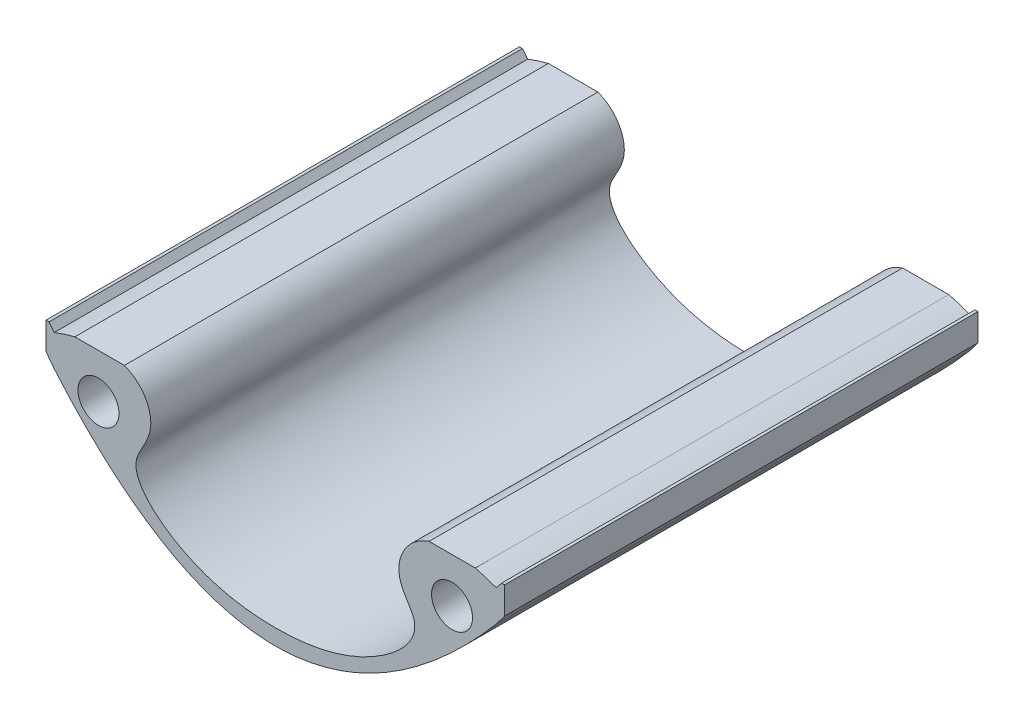
ISO-10303-21;
HEADER;
FILE_DESCRIPTION(('STEP AP214'),'2;1');
FILE_NAME('part.step','',(''),(''),'','','');
FILE_SCHEMA(('AUTOMOTIVE_DESIGN { 1 0 10303 214 1 1 1 1 }'));
ENDSEC;
DATA;
#1=APPLICATION_CONTEXT('core data for automotive mechanical design processes');
#2=APPLICATION_PROTOCOL_DEFINITION('international standard','automotive_design',2000,#1);
#3=PRODUCT_CONTEXT('',#1,'mechanical');
#4=PRODUCT('Part','Part','',(#3));
#5=PRODUCT_RELATED_PRODUCT_CATEGORY('part','',(#4));
#6=PRODUCT_DEFINITION_FORMATION('','',#4);
#7=PRODUCT_DEFINITION_CONTEXT('part definition',#1,'design');
#8=PRODUCT_DEFINITION('design','',#6,#7);
#9=PRODUCT_DEFINITION_SHAPE('','',#8);
#10=(LENGTH_UNIT() NAMED_UNIT(*) SI_UNIT(.MILLI.,.METRE.));
#11=(NAMED_UNIT(*) PLANE_ANGLE_UNIT() SI_UNIT($,.RADIAN.));
#12=(NAMED_UNIT(*) SI_UNIT($,.STERADIAN.) SOLID_ANGLE_UNIT());
#13=UNCERTAINTY_MEASURE_WITH_UNIT(LENGTH_MEASURE(1.E-05),#10,'distance_accuracy_value','');
#14=(GEOMETRIC_REPRESENTATION_CONTEXT(3) GLOBAL_UNCERTAINTY_ASSIGNED_CONTEXT((#13)) GLOBAL_UNIT_ASSIGNED_CONTEXT((#10,
#11,#12)) REPRESENTATION_CONTEXT('',''));
#15=CARTESIAN_POINT('',(0.,0.,0.));
#16=DIRECTION('',(0.,0.,1.));
#17=DIRECTION('',(1.,0.,0.));
#18=AXIS2_PLACEMENT_3D('',#15,#16,#17);
#19=CARTESIAN_POINT('',(35.,5.99999999999999,75.));
#20=CARTESIAN_POINT('',(24.2921708013809,10.0709870772063,75.));
#21=CARTESIAN_POINT('',(16.5043822104664,0.543390954215758,75.));
#22=CARTESIAN_POINT('',(25.4356568395255,-5.8640250434878,75.));
#23=CARTESIAN_POINT('',(14.4016739740054,-15.3382561778193,75.));
#24=CARTESIAN_POINT('',(0.0184245463514519,-17.8303801091997,75.));
#25=CARTESIAN_POINT('',(-14.4761462038401,-15.3053377993211,75.));
#26=CARTESIAN_POINT('',(-25.2121925396569,-5.97773988999585,75.));
#27=CARTESIAN_POINT('',(-16.8625489771599,0.916693829895384,75.));
#28=CARTESIAN_POINT('',(-23.9127171343916,10.2114500867204,75.));
#29=CARTESIAN_POINT('',(-35.,6.00000000000001,75.));
#30=B_SPLINE_CURVE_WITH_KNOTS('',3,(#19,#20,#21,#22,#23,#24,#25,#26,#27,#28,#29),.UNSPECIFIED.,
.F.,.F.,(4,1,1,1,1,1,1,1,4),(0.,0.0991916122989778,0.1945134469653,0.347327721109857,
0.496998051219649,0.646668381329442,0.799482655473999,0.89480449014032,1.),.UNSPECIFIED.);
#31=DIRECTION('',(0.,0.,-1.));
#32=VECTOR('',#31,1.);
#33=SURFACE_OF_LINEAR_EXTRUSION('',#30,#32);
#34=CARTESIAN_POINT('',(35.,5.99999999999999,0.));
#35=CARTESIAN_POINT('',(24.2921708013809,10.0709870772063,0.));
#36=CARTESIAN_POINT('',(16.5043822104664,0.543390954215758,0.));
#37=CARTESIAN_POINT('',(25.4356568395255,-5.8640250434878,0.));
#38=CARTESIAN_POINT('',(14.4016739740054,-15.3382561778193,0.));
#39=CARTESIAN_POINT('',(0.0184245463514519,-17.8303801091997,0.));
#40=CARTESIAN_POINT('',(-14.4761462038401,-15.3053377993211,0.));
#41=CARTESIAN_POINT('',(-25.2121925396569,-5.97773988999585,0.));
#42=CARTESIAN_POINT('',(-16.8625489771599,0.916693829895384,0.));
#43=CARTESIAN_POINT('',(-23.9127171343916,10.2114500867204,0.));
#44=CARTESIAN_POINT('',(-35.,6.00000000000001,0.));
#45=B_SPLINE_CURVE_WITH_KNOTS('',3,(#34,#35,#36,#37,#38,#39,#40,#41,#42,#43,#44),.UNSPECIFIED.,
.F.,.F.,(4,1,1,1,1,1,1,1,4),(0.,0.0991916122989778,0.1945134469653,0.347327721109857,
0.496998051219649,0.646668381329442,0.799482655473999,0.89480449014032,1.),.UNSPECIFIED.);
#46=CARTESIAN_POINT('',(35.,6.00000000000001,0.));
#47=VERTEX_POINT('',#46);
#48=CARTESIAN_POINT('',(31.6802542880278,7.03951031849051,0.));
#49=VERTEX_POINT('',#48);
#50=EDGE_CURVE('E387',#47,#49,#45,.T.);
#51=ORIENTED_EDGE('',*,*,#50,.T.);
#52=DIRECTION('',(0.,0.,-1.));
#53=VECTOR('',#52,1.);
#54=CARTESIAN_POINT('',(31.6802544507426,7.03951031849051,75.));
#55=LINE('',#54,#53);
#56=CARTESIAN_POINT('',(31.6802542880278,7.03951031849051,75.));
#57=VERTEX_POINT('',#56);
#58=EDGE_CURVE('E178',#49,#57,#55,.F.);
#59=ORIENTED_EDGE('',*,*,#58,.T.);
#60=CARTESIAN_POINT('',(35.,6.00000000000001,75.));
#61=VERTEX_POINT('',#60);
#62=EDGE_CURVE('E275',#61,#57,#30,.T.);
#63=ORIENTED_EDGE('',*,*,#62,.F.);
#64=DIRECTION('',(0.,0.,-1.));
#65=VECTOR('',#64,1.);
#66=CARTESIAN_POINT('',(35.,6.00000000000001,75.));
#67=LINE('',#66,#65);
#68=EDGE_CURVE('E385',#61,#47,#67,.T.);
#69=ORIENTED_EDGE('',*,*,#68,.T.);
#70=EDGE_LOOP('',(#51,#59,#63,#69));
#71=FACE_BOUND('',#70,.T.);
#72=ADVANCED_FACE('F39',(#71),#33,.F.);
#73=CARTESIAN_POINT('',(24.3666960420927,7.03951031849051,75.));
#74=VERTEX_POINT('',#73);
#75=CARTESIAN_POINT('',(-23.9011082918852,7.03951031849051,75.));
#76=VERTEX_POINT('',#75);
#77=EDGE_CURVE('E286',#74,#76,#30,.T.);
#78=ORIENTED_EDGE('',*,*,#77,.F.);
#79=DIRECTION('',(0.,0.,-1.));
#80=VECTOR('',#79,1.);
#81=CARTESIAN_POINT('',(24.3666960420927,7.03951031849051,75.));
#82=LINE('',#81,#80);
#83=CARTESIAN_POINT('',(24.3666960420927,7.03951031849051,0.));
#84=VERTEX_POINT('',#83);
#85=EDGE_CURVE('E197',#74,#84,#82,.T.);
#86=ORIENTED_EDGE('',*,*,#85,.T.);
#87=CARTESIAN_POINT('',(-23.9011082918852,7.03951031849051,0.));
#88=VERTEX_POINT('',#87);
#89=EDGE_CURVE('E348',#84,#88,#45,.T.);
#90=ORIENTED_EDGE('',*,*,#89,.T.);
#91=DIRECTION('',(0.,0.,-1.));
#92=VECTOR('',#91,1.);
#93=CARTESIAN_POINT('',(-23.9011081901879,7.03951031849051,75.));
#94=LINE('',#93,#92);
#95=EDGE_CURVE('E191',#88,#76,#94,.F.);
#96=ORIENTED_EDGE('',*,*,#95,.T.);
#97=EDGE_LOOP('',(#78,#86,#90,#96));
#98=FACE_BOUND('',#97,.T.);
#99=ADVANCED_FACE('F313',(#98),#33,.F.);
#100=CARTESIAN_POINT('',(-51.25,40.25,75.));
#101=DIRECTION('',(0.,0.,1.));
#102=DIRECTION('',(1.,0.,0.));
#103=AXIS2_PLACEMENT_3D('',#100,#101,#102);
#104=PLANE('',#103);
#105=DIRECTION('',(0.,-1.,0.));
#106=VECTOR('',#105,1.);
#107=CARTESIAN_POINT('',(36.3120835122941,40.25,75.));
#108=LINE('',#107,#106);
#109=CARTESIAN_POINT('',(36.3120835122942,7.03951031849051,75.));
#110=VERTEX_POINT('',#109);
#111=CARTESIAN_POINT('',(36.3120835122942,2.74184273874525,75.));
#112=VERTEX_POINT('',#111);
#113=EDGE_CURVE('E140',#110,#112,#108,.T.);
#114=ORIENTED_EDGE('',*,*,#113,.F.);
#115=DIRECTION('',(1.,0.,0.));
#116=VECTOR('',#115,1.);
#117=CARTESIAN_POINT('',(-51.25,7.03951031849051,75.));
#118=LINE('',#117,#116);
#119=CARTESIAN_POINT('',(35.842563463064,7.0395103184905,75.));
#120=VERTEX_POINT('',#119);
#121=EDGE_CURVE('E152',#120,#110,#118,.T.);
#122=ORIENTED_EDGE('',*,*,#121,.F.);
#123=CARTESIAN_POINT('',(38.,80.,75.));
#124=CARTESIAN_POINT('',(63.,40.,75.));
#125=CARTESIAN_POINT('',(35.,6.00000000000001,75.));
#126=B_SPLINE_CURVE_WITH_KNOTS('',2,(#123,#124,#125),.UNSPECIFIED.,.F.,.F.,(3,3),(0.,1.),.UNSPECIFIED.);
#127=EDGE_CURVE('E269',#120,#61,#126,.T.);
#128=ORIENTED_EDGE('',*,*,#127,.T.);
#129=ORIENTED_EDGE('',*,*,#62,.T.);
#130=EDGE_CURVE('E166',#74,#57,#118,.T.);
#131=ORIENTED_EDGE('',*,*,#130,.F.);
#132=ORIENTED_EDGE('',*,*,#77,.T.);
#133=CARTESIAN_POINT('',(-31.7421616075453,7.03951031849051,75.));
#134=VERTEX_POINT('',#133);
#135=EDGE_CURVE('E179',#134,#76,#118,.T.);
#136=ORIENTED_EDGE('',*,*,#135,.F.);
#137=CARTESIAN_POINT('',(-35.,6.00000000000001,75.));
#138=VERTEX_POINT('',#137);
#139=EDGE_CURVE('E274',#134,#138,#30,.T.);
#140=ORIENTED_EDGE('',*,*,#139,.T.);
#141=CARTESIAN_POINT('',(-35.,6.00000000000001,75.));
#142=CARTESIAN_POINT('',(-63.,40.,75.));
#143=CARTESIAN_POINT('',(-38.,80.,75.));
#144=B_SPLINE_CURVE_WITH_KNOTS('',2,(#141,#142,#143),.UNSPECIFIED.,.F.,.F.,(3,3),(0.,1.),.UNSPECIFIED.);
#145=CARTESIAN_POINT('',(-35.8425634630639,7.03951031849035,75.));
#146=VERTEX_POINT('',#145);
#147=EDGE_CURVE('E285',#138,#146,#144,.T.);
#148=ORIENTED_EDGE('',*,*,#147,.T.);
#149=CARTESIAN_POINT('',(-36.3120835122941,7.03951031849051,75.));
#150=VERTEX_POINT('',#149);
#151=EDGE_CURVE('E167',#150,#146,#118,.T.);
#152=ORIENTED_EDGE('',*,*,#151,.F.);
#153=DIRECTION('',(0.,1.,0.));
#154=VECTOR('',#153,1.);
#155=CARTESIAN_POINT('',(-36.3120835122941,40.25,75.));
#156=LINE('',#155,#154);
#157=CARTESIAN_POINT('',(-36.3120835122941,2.74184273874521,75.));
#158=VERTEX_POINT('',#157);
#159=EDGE_CURVE('E56',#158,#150,#156,.T.);
#160=ORIENTED_EDGE('',*,*,#159,.F.);
#161=CARTESIAN_POINT('',(-40.,80.,75.));
#162=CARTESIAN_POINT('',(-65.,40.,75.));
#163=CARTESIAN_POINT('',(-35.,0.999999999999992,75.));
#164=B_SPLINE_CURVE_WITH_KNOTS('',2,(#161,#162,#163),.UNSPECIFIED.,.F.,.F.,(3,3),(0.,1.),.UNSPECIFIED.);
#165=CARTESIAN_POINT('',(-35.,0.999999999999992,75.));
#166=VERTEX_POINT('',#165);
#167=EDGE_CURVE('E231',#158,#166,#164,.T.);
#168=ORIENTED_EDGE('',*,*,#167,.T.);
#169=CARTESIAN_POINT('',(-35.,0.999999999999992,75.));
#170=CARTESIAN_POINT('',(0.,-40.,75.));
#171=CARTESIAN_POINT('',(35.,1.00000000000001,75.));
#172=B_SPLINE_CURVE_WITH_KNOTS('',2,(#169,#170,#171),.UNSPECIFIED.,.F.,.F.,(3,3),(0.,1.),.UNSPECIFIED.);
#173=CARTESIAN_POINT('',(35.,1.00000000000001,75.));
#174=VERTEX_POINT('',#173);
#175=EDGE_CURVE('E237',#166,#174,#172,.T.);
#176=ORIENTED_EDGE('',*,*,#175,.T.);
#177=CARTESIAN_POINT('',(35.,1.00000000000001,75.));
#178=CARTESIAN_POINT('',(65.,40.,75.));
#179=CARTESIAN_POINT('',(40.,80.,75.));
#180=B_SPLINE_CURVE_WITH_KNOTS('',2,(#177,#178,#179),.UNSPECIFIED.,.F.,.F.,(3,3),(0.,1.),.UNSPECIFIED.);
#181=EDGE_CURVE('E155',#174,#112,#180,.T.);
#182=ORIENTED_EDGE('',*,*,#181,.T.);
#183=EDGE_LOOP('',(#114,#122,#128,#129,#131,#132,#136,#140,#148,#152,#160,#168,#176,#182));
#184=FACE_BOUND('',#183,.T.);
#185=CARTESIAN_POINT('',(-28.,0.,75.));
#186=DIRECTION('',(0.,0.,1.));
#187=DIRECTION('',(1.,0.,0.));
#188=AXIS2_PLACEMENT_3D('',#185,#186,#187);
#189=CIRCLE('',#188,3.25);
#190=CARTESIAN_POINT('',(-24.75,0.,75.));
#191=VERTEX_POINT('',#190);
#192=EDGE_CURVE('E224',#191,#191,#189,.T.);
#193=ORIENTED_EDGE('',*,*,#192,.F.);
#194=EDGE_LOOP('',(#193));
#195=FACE_BOUND('',#194,.T.);
#196=CARTESIAN_POINT('',(28.,0.,75.));
#197=DIRECTION('',(0.,0.,1.));
#198=DIRECTION('',(1.,0.,0.));
#199=AXIS2_PLACEMENT_3D('',#196,#197,#198);
#200=CIRCLE('',#199,3.25);
#201=CARTESIAN_POINT('',(31.25,0.,75.));
#202=VERTEX_POINT('',#201);
#203=EDGE_CURVE('E171',#202,#202,#200,.T.);
#204=ORIENTED_EDGE('',*,*,#203,.F.);
#205=EDGE_LOOP('',(#204));
#206=FACE_BOUND('',#205,.T.);
#207=ADVANCED_FACE('F150',(#184,#195,#206),#104,.T.);
#208=CARTESIAN_POINT('',(-51.25,40.25,0.));
#209=DIRECTION('',(0.,0.,1.));
#210=DIRECTION('',(1.,0.,0.));
#211=AXIS2_PLACEMENT_3D('',#208,#209,#210);
#212=PLANE('',#211);
#213=DIRECTION('',(1.,0.,0.));
#214=VECTOR('',#213,1.);
#215=CARTESIAN_POINT('',(-51.25,7.03951031849051,0.));
#216=LINE('',#215,#214);
#217=CARTESIAN_POINT('',(35.8425634630639,7.03951031849033,0.));
#218=VERTEX_POINT('',#217);
#219=CARTESIAN_POINT('',(36.3120835122941,7.03951031849051,0.));
#220=VERTEX_POINT('',#219);
#221=EDGE_CURVE('E164',#218,#220,#216,.T.);
#222=ORIENTED_EDGE('',*,*,#221,.T.);
#223=DIRECTION('',(0.,-1.,0.));
#224=VECTOR('',#223,1.);
#225=CARTESIAN_POINT('',(36.3120835122941,40.25,0.));
#226=LINE('',#225,#224);
#227=CARTESIAN_POINT('',(36.3120835122942,2.74184273874525,0.));
#228=VERTEX_POINT('',#227);
#229=EDGE_CURVE('E63',#220,#228,#226,.T.);
#230=ORIENTED_EDGE('',*,*,#229,.T.);
#231=CARTESIAN_POINT('',(35.,1.00000000000001,0.));
#232=CARTESIAN_POINT('',(65.,40.,0.));
#233=CARTESIAN_POINT('',(40.,80.,0.));
#234=B_SPLINE_CURVE_WITH_KNOTS('',2,(#231,#232,#233),.UNSPECIFIED.,.F.,.F.,(3,3),(0.,1.),.UNSPECIFIED.);
#235=CARTESIAN_POINT('',(35.,1.00000000000001,0.));
#236=VERTEX_POINT('',#235);
#237=EDGE_CURVE('E380',#236,#228,#234,.T.);
#238=ORIENTED_EDGE('',*,*,#237,.F.);
#239=CARTESIAN_POINT('',(-35.,0.999999999999992,0.));
#240=CARTESIAN_POINT('',(0.,-40.,0.));
#241=CARTESIAN_POINT('',(35.,1.00000000000001,0.));
#242=B_SPLINE_CURVE_WITH_KNOTS('',2,(#239,#240,#241),.UNSPECIFIED.,.F.,.F.,(3,3),(0.,1.),.UNSPECIFIED.);
#243=CARTESIAN_POINT('',(-35.,0.999999999999992,0.));
#244=VERTEX_POINT('',#243);
#245=EDGE_CURVE('E400',#244,#236,#242,.T.);
#246=ORIENTED_EDGE('',*,*,#245,.F.);
#247=CARTESIAN_POINT('',(-40.,80.,0.));
#248=CARTESIAN_POINT('',(-65.,40.,0.));
#249=CARTESIAN_POINT('',(-35.,0.999999999999992,0.));
#250=B_SPLINE_CURVE_WITH_KNOTS('',2,(#247,#248,#249),.UNSPECIFIED.,.F.,.F.,(3,3),(0.,1.),.UNSPECIFIED.);
#251=CARTESIAN_POINT('',(-36.3120835122941,2.74184273874521,0.));
#252=VERTEX_POINT('',#251);
#253=EDGE_CURVE('E228',#252,#244,#250,.T.);
#254=ORIENTED_EDGE('',*,*,#253,.F.);
#255=DIRECTION('',(0.,1.,0.));
#256=VECTOR('',#255,1.);
#257=CARTESIAN_POINT('',(-36.3120835122942,40.25,0.));
#258=LINE('',#257,#256);
#259=CARTESIAN_POINT('',(-36.3120835122942,7.03951031849051,0.));
#260=VERTEX_POINT('',#259);
#261=EDGE_CURVE('E364',#252,#260,#258,.T.);
#262=ORIENTED_EDGE('',*,*,#261,.T.);
#263=CARTESIAN_POINT('',(-35.842563463064,7.03951031849051,0.));
#264=VERTEX_POINT('',#263);
#265=EDGE_CURVE('E175',#260,#264,#216,.T.);
#266=ORIENTED_EDGE('',*,*,#265,.T.);
#267=CARTESIAN_POINT('',(-35.,6.00000000000001,0.));
#268=CARTESIAN_POINT('',(-63.,40.,0.));
#269=CARTESIAN_POINT('',(-38.,80.,0.));
#270=B_SPLINE_CURVE_WITH_KNOTS('',2,(#267,#268,#269),.UNSPECIFIED.,.F.,.F.,(3,3),(0.,1.),.UNSPECIFIED.);
#271=CARTESIAN_POINT('',(-35.,6.00000000000001,0.));
#272=VERTEX_POINT('',#271);
#273=EDGE_CURVE('E238',#272,#264,#270,.T.);
#274=ORIENTED_EDGE('',*,*,#273,.F.);
#275=CARTESIAN_POINT('',(-31.7421616075453,7.03951031849051,0.));
#276=VERTEX_POINT('',#275);
#277=EDGE_CURVE('E390',#276,#272,#45,.T.);
#278=ORIENTED_EDGE('',*,*,#277,.F.);
#279=EDGE_CURVE('E189',#276,#88,#216,.T.);
#280=ORIENTED_EDGE('',*,*,#279,.T.);
#281=ORIENTED_EDGE('',*,*,#89,.F.);
#282=EDGE_CURVE('E174',#84,#49,#216,.T.);
#283=ORIENTED_EDGE('',*,*,#282,.T.);
#284=ORIENTED_EDGE('',*,*,#50,.F.);
#285=CARTESIAN_POINT('',(38.,80.,0.));
#286=CARTESIAN_POINT('',(63.,40.,0.));
#287=CARTESIAN_POINT('',(35.,6.00000000000001,0.));
#288=B_SPLINE_CURVE_WITH_KNOTS('',2,(#285,#286,#287),.UNSPECIFIED.,.F.,.F.,(3,3),(0.,1.),.UNSPECIFIED.);
#289=EDGE_CURVE('E382',#218,#47,#288,.T.);
#290=ORIENTED_EDGE('',*,*,#289,.F.);
#291=EDGE_LOOP('',(#222,#230,#238,#246,#254,#262,#266,#274,#278,#280,#281,#283,#284,#290));
#292=FACE_BOUND('',#291,.T.);
#293=CARTESIAN_POINT('',(-28.,0.,0.));
#294=DIRECTION('',(0.,0.,1.));
#295=DIRECTION('',(1.,0.,0.));
#296=AXIS2_PLACEMENT_3D('',#293,#294,#295);
#297=CIRCLE('',#296,3.25);
#298=CARTESIAN_POINT('',(-24.75,0.,0.));
#299=VERTEX_POINT('',#298);
#300=EDGE_CURVE('E222',#299,#299,#297,.T.);
#301=ORIENTED_EDGE('',*,*,#300,.T.);
#302=EDGE_LOOP('',(#301));
#303=FACE_BOUND('',#302,.T.);
#304=CARTESIAN_POINT('',(28.,0.,0.));
#305=DIRECTION('',(0.,0.,1.));
#306=DIRECTION('',(1.,0.,0.));
#307=AXIS2_PLACEMENT_3D('',#304,#305,#306);
#308=CIRCLE('',#307,3.25);
#309=CARTESIAN_POINT('',(31.25,0.,0.));
#310=VERTEX_POINT('',#309);
#311=EDGE_CURVE('E163',#310,#310,#308,.T.);
#312=ORIENTED_EDGE('',*,*,#311,.T.);
#313=EDGE_LOOP('',(#312));
#314=FACE_BOUND('',#313,.T.);
#315=ADVANCED_FACE('F308',(#292,#303,#314),#212,.F.);
#316=DIRECTION('',(0.,0.,-1.));
#317=VECTOR('',#316,1.);
#318=SURFACE_OF_LINEAR_EXTRUSION('',#164,#317);
#319=ORIENTED_EDGE('',*,*,#167,.F.);
#320=DIRECTION('',(0.,0.,-1.));
#321=VECTOR('',#320,1.);
#322=CARTESIAN_POINT('',(-36.3120835122941,2.74184273874521,75.));
#323=LINE('',#322,#321);
#324=EDGE_CURVE('E157',#158,#252,#323,.T.);
#325=ORIENTED_EDGE('',*,*,#324,.T.);
#326=ORIENTED_EDGE('',*,*,#253,.T.);
#327=DIRECTION('',(0.,0.,-1.));
#328=VECTOR('',#327,1.);
#329=CARTESIAN_POINT('',(-35.,0.999999999999992,75.));
#330=LINE('',#329,#328);
#331=EDGE_CURVE('E424',#166,#244,#330,.T.);
#332=ORIENTED_EDGE('',*,*,#331,.F.);
#333=EDGE_LOOP('',(#319,#325,#326,#332));
#334=FACE_BOUND('',#333,.T.);
#335=ADVANCED_FACE('F41',(#334),#318,.F.);
#336=DIRECTION('',(0.,0.,-1.));
#337=VECTOR('',#336,1.);
#338=SURFACE_OF_LINEAR_EXTRUSION('',#172,#337);
#339=ORIENTED_EDGE('',*,*,#245,.T.);
#340=DIRECTION('',(0.,0.,-1.));
#341=VECTOR('',#340,1.);
#342=CARTESIAN_POINT('',(35.,1.00000000000001,75.));
#343=LINE('',#342,#341);
#344=EDGE_CURVE('E427',#174,#236,#343,.T.);
#345=ORIENTED_EDGE('',*,*,#344,.F.);
#346=ORIENTED_EDGE('',*,*,#175,.F.);
#347=ORIENTED_EDGE('',*,*,#331,.T.);
#348=EDGE_LOOP('',(#339,#345,#346,#347));
#349=FACE_BOUND('',#348,.T.);
#350=ADVANCED_FACE('F254',(#349),#338,.F.);
#351=DIRECTION('',(0.,0.,-1.));
#352=VECTOR('',#351,1.);
#353=SURFACE_OF_LINEAR_EXTRUSION('',#180,#352);
#354=ORIENTED_EDGE('',*,*,#237,.T.);
#355=DIRECTION('',(0.,0.,-1.));
#356=VECTOR('',#355,1.);
#357=CARTESIAN_POINT('',(36.3120835122942,2.74184273874525,75.));
#358=LINE('',#357,#356);
#359=EDGE_CURVE('E375',#228,#112,#358,.F.);
#360=ORIENTED_EDGE('',*,*,#359,.T.);
#361=ORIENTED_EDGE('',*,*,#181,.F.);
#362=ORIENTED_EDGE('',*,*,#344,.T.);
#363=EDGE_LOOP('',(#354,#360,#361,#362));
#364=FACE_BOUND('',#363,.T.);
#365=ADVANCED_FACE('F257',(#364),#353,.F.);
#366=DIRECTION('',(0.,0.,-1.));
#367=VECTOR('',#366,1.);
#368=SURFACE_OF_LINEAR_EXTRUSION('',#126,#367);
#369=ORIENTED_EDGE('',*,*,#127,.F.);
#370=DIRECTION('',(0.,0.,-1.));
#371=VECTOR('',#370,1.);
#372=CARTESIAN_POINT('',(35.842563463064,7.0395103184905,75.));
#373=LINE('',#372,#371);
#374=EDGE_CURVE('E161',#120,#218,#373,.T.);
#375=ORIENTED_EDGE('',*,*,#374,.T.);
#376=ORIENTED_EDGE('',*,*,#289,.T.);
#377=ORIENTED_EDGE('',*,*,#68,.F.);
#378=EDGE_LOOP('',(#369,#375,#376,#377));
#379=FACE_BOUND('',#378,.T.);
#380=ADVANCED_FACE('F261',(#379),#368,.F.);
#381=ORIENTED_EDGE('',*,*,#139,.F.);
#382=DIRECTION('',(0.,0.,-1.));
#383=VECTOR('',#382,1.);
#384=CARTESIAN_POINT('',(-31.7421616075453,7.03951031849051,75.));
#385=LINE('',#384,#383);
#386=EDGE_CURVE('E181',#134,#276,#385,.T.);
#387=ORIENTED_EDGE('',*,*,#386,.T.);
#388=ORIENTED_EDGE('',*,*,#277,.T.);
#389=DIRECTION('',(0.,0.,-1.));
#390=VECTOR('',#389,1.);
#391=CARTESIAN_POINT('',(-35.,6.00000000000001,75.));
#392=LINE('',#391,#390);
#393=EDGE_CURVE('E296',#138,#272,#392,.T.);
#394=ORIENTED_EDGE('',*,*,#393,.F.);
#395=EDGE_LOOP('',(#381,#387,#388,#394));
#396=FACE_BOUND('',#395,.T.);
#397=ADVANCED_FACE('F265',(#396),#33,.F.);
#398=DIRECTION('',(0.,0.,-1.));
#399=VECTOR('',#398,1.);
#400=SURFACE_OF_LINEAR_EXTRUSION('',#144,#399);
#401=ORIENTED_EDGE('',*,*,#273,.T.);
#402=DIRECTION('',(0.,0.,-1.));
#403=VECTOR('',#402,1.);
#404=CARTESIAN_POINT('',(-35.842563463064,7.03951031849051,75.));
#405=LINE('',#404,#403);
#406=EDGE_CURVE('E146',#264,#146,#405,.F.);
#407=ORIENTED_EDGE('',*,*,#406,.T.);
#408=ORIENTED_EDGE('',*,*,#147,.F.);
#409=ORIENTED_EDGE('',*,*,#393,.T.);
#410=EDGE_LOOP('',(#401,#407,#408,#409));
#411=FACE_BOUND('',#410,.T.);
#412=ADVANCED_FACE('F303',(#411),#400,.F.);
#413=CARTESIAN_POINT('',(-28.,0.,75.));
#414=DIRECTION('',(0.,0.,-1.));
#415=DIRECTION('',(-1.,0.,0.));
#416=AXIS2_PLACEMENT_3D('',#413,#414,#415);
#417=CYLINDRICAL_SURFACE('',#416,3.25);
#418=ORIENTED_EDGE('',*,*,#192,.T.);
#419=EDGE_LOOP('',(#418));
#420=FACE_BOUND('',#419,.T.);
#421=ORIENTED_EDGE('',*,*,#300,.F.);
#422=EDGE_LOOP('',(#421));
#423=FACE_BOUND('',#422,.T.);
#424=ADVANCED_FACE('F306',(#420,#423),#417,.F.);
#425=CARTESIAN_POINT('',(28.,0.,75.));
#426=DIRECTION('',(0.,0.,-1.));
#427=DIRECTION('',(-1.,0.,0.));
#428=AXIS2_PLACEMENT_3D('',#425,#426,#427);
#429=CYLINDRICAL_SURFACE('',#428,3.25);
#430=ORIENTED_EDGE('',*,*,#203,.T.);
#431=EDGE_LOOP('',(#430));
#432=FACE_BOUND('',#431,.T.);
#433=ORIENTED_EDGE('',*,*,#311,.F.);
#434=EDGE_LOOP('',(#433));
#435=FACE_BOUND('',#434,.T.);
#436=ADVANCED_FACE('F316',(#432,#435),#429,.F.);
#437=CARTESIAN_POINT('',(-52.5,7.03951031849051,87.5483159947577));
#438=DIRECTION('',(0.,-1.,0.));
#439=DIRECTION('',(0.,0.,-1.));
#440=AXIS2_PLACEMENT_3D('',#437,#438,#439);
#441=PLANE('',#440);
#442=ORIENTED_EDGE('',*,*,#265,.F.);
#443=DIRECTION('',(0.,0.,1.));
#444=VECTOR('',#443,1.);
#445=CARTESIAN_POINT('',(-36.3120835122941,7.03951031849051,87.5483159947577));
#446=LINE('',#445,#444);
#447=EDGE_CURVE('E11',#260,#150,#446,.T.);
#448=ORIENTED_EDGE('',*,*,#447,.T.);
#449=ORIENTED_EDGE('',*,*,#151,.T.);
#450=ORIENTED_EDGE('',*,*,#406,.F.);
#451=EDGE_LOOP('',(#442,#448,#449,#450));
#452=FACE_BOUND('',#451,.T.);
#453=ADVANCED_FACE('F320',(#452),#441,.F.);
#454=ORIENTED_EDGE('',*,*,#279,.F.);
#455=ORIENTED_EDGE('',*,*,#386,.F.);
#456=ORIENTED_EDGE('',*,*,#135,.T.);
#457=ORIENTED_EDGE('',*,*,#95,.F.);
#458=EDGE_LOOP('',(#454,#455,#456,#457));
#459=FACE_BOUND('',#458,.T.);
#460=ADVANCED_FACE('F349',(#459),#441,.F.);
#461=ORIENTED_EDGE('',*,*,#282,.F.);
#462=ORIENTED_EDGE('',*,*,#85,.F.);
#463=ORIENTED_EDGE('',*,*,#130,.T.);
#464=ORIENTED_EDGE('',*,*,#58,.F.);
#465=EDGE_LOOP('',(#461,#462,#463,#464));
#466=FACE_BOUND('',#465,.T.);
#467=ADVANCED_FACE('F324',(#466),#441,.F.);
#468=ORIENTED_EDGE('',*,*,#121,.T.);
#469=DIRECTION('',(0.,0.,-1.));
#470=VECTOR('',#469,1.);
#471=CARTESIAN_POINT('',(36.3120835122941,7.03951031849051,87.5483159947577));
#472=LINE('',#471,#470);
#473=EDGE_CURVE('E49',#110,#220,#472,.T.);
#474=ORIENTED_EDGE('',*,*,#473,.T.);
#475=ORIENTED_EDGE('',*,*,#221,.F.);
#476=ORIENTED_EDGE('',*,*,#374,.F.);
#477=EDGE_LOOP('',(#468,#474,#475,#476));
#478=FACE_BOUND('',#477,.T.);
#479=ADVANCED_FACE('F159',(#478),#441,.F.);
#480=CARTESIAN_POINT('',(36.3120835122941,-19.5,-12.7627123426829));
#481=DIRECTION('',(-1.,0.,0.));
#482=DIRECTION('',(0.,0.,1.));
#483=AXIS2_PLACEMENT_3D('',#480,#481,#482);
#484=PLANE('',#483);
#485=ORIENTED_EDGE('',*,*,#113,.T.);
#486=ORIENTED_EDGE('',*,*,#359,.F.);
#487=ORIENTED_EDGE('',*,*,#229,.F.);
#488=ORIENTED_EDGE('',*,*,#473,.F.);
#489=EDGE_LOOP('',(#485,#486,#487,#488));
#490=FACE_BOUND('',#489,.T.);
#491=ADVANCED_FACE('F139',(#490),#484,.F.);
#492=CARTESIAN_POINT('',(-36.3120835122942,-19.5,-22.5257915232235));
#493=DIRECTION('',(1.,0.,0.));
#494=DIRECTION('',(0.,0.,-1.));
#495=AXIS2_PLACEMENT_3D('',#492,#493,#494);
#496=PLANE('',#495);
#497=ORIENTED_EDGE('',*,*,#159,.T.);
#498=ORIENTED_EDGE('',*,*,#447,.F.);
#499=ORIENTED_EDGE('',*,*,#261,.F.);
#500=ORIENTED_EDGE('',*,*,#324,.F.);
#501=EDGE_LOOP('',(#497,#498,#499,#500));
#502=FACE_BOUND('',#501,.T.);
#503=ADVANCED_FACE('F325',(#502),#496,.F.);
#504=CLOSED_SHELL('',(#72,#99,#207,#315,#335,#350,#365,#380,#397,#412,#424,#436,#453,#460,#467,
#479,#491,#503));
#505=MANIFOLD_SOLID_BREP('B2',#504);
#506=ADVANCED_BREP_SHAPE_REPRESENTATION('',(#18,#505),#14);
#507=SHAPE_DEFINITION_REPRESENTATION(#9,#506);
ENDSEC;
END-ISO-10303-21;
